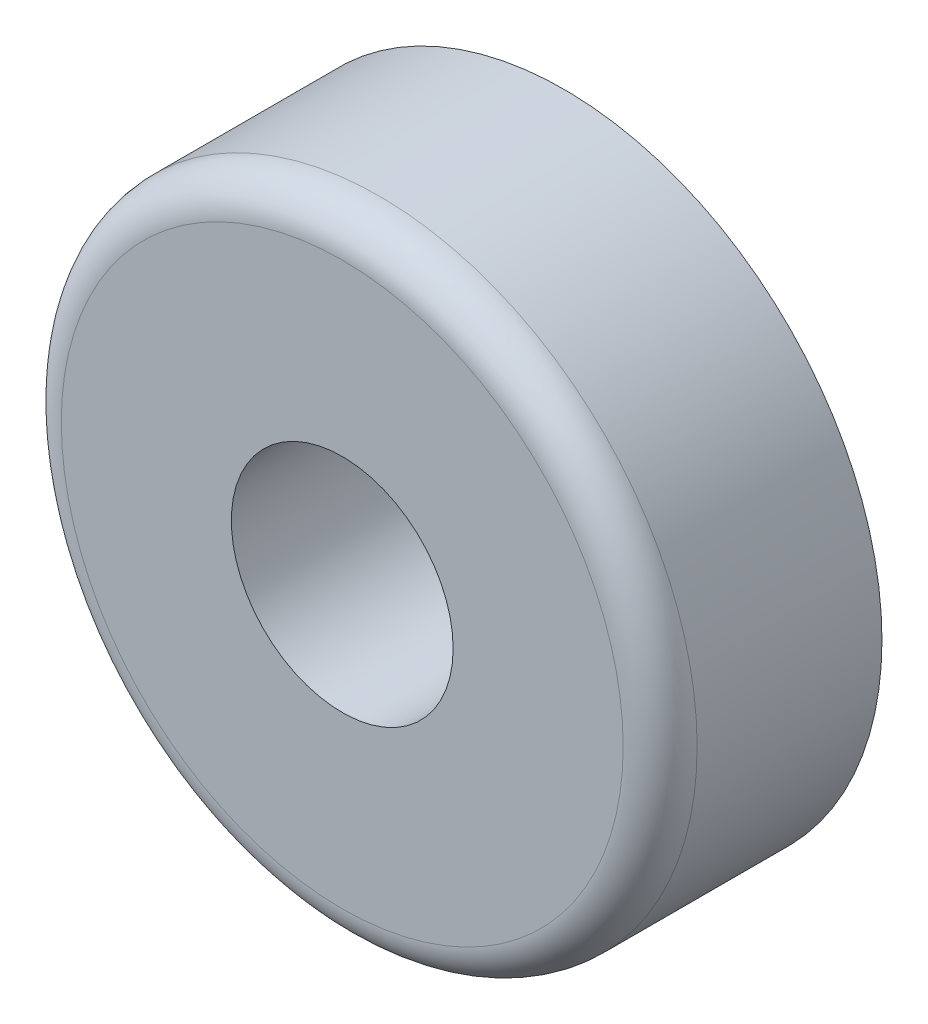
ISO-10303-21;
HEADER;
FILE_DESCRIPTION(('STEP AP214'),'2;1');
FILE_NAME('part.step','',(''),(''),'','','');
FILE_SCHEMA(('AUTOMOTIVE_DESIGN { 1 0 10303 214 1 1 1 1 }'));
ENDSEC;
DATA;
#1=APPLICATION_CONTEXT('core data for automotive mechanical design processes');
#2=APPLICATION_PROTOCOL_DEFINITION('international standard','automotive_design',2000,#1);
#3=PRODUCT_CONTEXT('',#1,'mechanical');
#4=PRODUCT('Part','Part','',(#3));
#5=PRODUCT_RELATED_PRODUCT_CATEGORY('part','',(#4));
#6=PRODUCT_DEFINITION_FORMATION('','',#4);
#7=PRODUCT_DEFINITION_CONTEXT('part definition',#1,'design');
#8=PRODUCT_DEFINITION('design','',#6,#7);
#9=PRODUCT_DEFINITION_SHAPE('','',#8);
#10=(LENGTH_UNIT() NAMED_UNIT(*) SI_UNIT(.MILLI.,.METRE.));
#11=(NAMED_UNIT(*) PLANE_ANGLE_UNIT() SI_UNIT($,.RADIAN.));
#12=(NAMED_UNIT(*) SI_UNIT($,.STERADIAN.) SOLID_ANGLE_UNIT());
#13=UNCERTAINTY_MEASURE_WITH_UNIT(LENGTH_MEASURE(1.E-05),#10,'distance_accuracy_value','');
#14=(GEOMETRIC_REPRESENTATION_CONTEXT(3) GLOBAL_UNCERTAINTY_ASSIGNED_CONTEXT((#13)) GLOBAL_UNIT_ASSIGNED_CONTEXT((#10,
#11,#12)) REPRESENTATION_CONTEXT('',''));
#15=CARTESIAN_POINT('',(0.,0.,0.));
#16=DIRECTION('',(0.,0.,1.));
#17=DIRECTION('',(1.,0.,0.));
#18=AXIS2_PLACEMENT_3D('',#15,#16,#17);
#19=CARTESIAN_POINT('',(0.,0.,3.));
#20=DIRECTION('',(0.,0.,1.));
#21=DIRECTION('',(1.,0.,0.));
#22=AXIS2_PLACEMENT_3D('',#19,#20,#21);
#23=PLANE('',#22);
#24=CARTESIAN_POINT('',(0.,0.,3.));
#25=DIRECTION('',(0.,0.,1.));
#26=DIRECTION('',(1.,0.,0.));
#27=AXIS2_PLACEMENT_3D('',#24,#25,#26);
#28=CIRCLE('',#27,3.8);
#29=CARTESIAN_POINT('',(3.8,0.,3.));
#30=VERTEX_POINT('',#29);
#31=EDGE_CURVE('E49',#30,#30,#28,.T.);
#32=ORIENTED_EDGE('',*,*,#31,.T.);
#33=EDGE_LOOP('',(#32));
#34=FACE_BOUND('',#33,.T.);
#35=CARTESIAN_POINT('',(0.,0.,3.));
#36=DIRECTION('',(0.,0.,1.));
#37=DIRECTION('',(1.,0.,0.));
#38=AXIS2_PLACEMENT_3D('',#35,#36,#37);
#39=CIRCLE('',#38,1.5);
#40=CARTESIAN_POINT('',(1.5,0.,3.));
#41=VERTEX_POINT('',#40);
#42=EDGE_CURVE('E59',#41,#41,#39,.T.);
#43=ORIENTED_EDGE('',*,*,#42,.F.);
#44=EDGE_LOOP('',(#43));
#45=FACE_BOUND('',#44,.T.);
#46=ADVANCED_FACE('F41',(#34,#45),#23,.T.);
#47=CARTESIAN_POINT('',(0.,0.,0.));
#48=DIRECTION('',(0.,0.,1.));
#49=DIRECTION('',(1.,0.,0.));
#50=AXIS2_PLACEMENT_3D('',#47,#48,#49);
#51=PLANE('',#50);
#52=CARTESIAN_POINT('',(0.,0.,0.));
#53=DIRECTION('',(0.,0.,1.));
#54=DIRECTION('',(1.,0.,0.));
#55=AXIS2_PLACEMENT_3D('',#52,#53,#54);
#56=CIRCLE('',#55,4.3);
#57=CARTESIAN_POINT('',(4.3,0.,0.));
#58=VERTEX_POINT('',#57);
#59=EDGE_CURVE('E54',#58,#58,#56,.T.);
#60=ORIENTED_EDGE('',*,*,#59,.F.);
#61=EDGE_LOOP('',(#60));
#62=FACE_BOUND('',#61,.T.);
#63=CARTESIAN_POINT('',(0.,0.,0.));
#64=DIRECTION('',(0.,0.,1.));
#65=DIRECTION('',(1.,0.,0.));
#66=AXIS2_PLACEMENT_3D('',#63,#64,#65);
#67=CIRCLE('',#66,1.5);
#68=CARTESIAN_POINT('',(1.5,0.,0.));
#69=VERTEX_POINT('',#68);
#70=EDGE_CURVE('E62',#69,#69,#67,.T.);
#71=ORIENTED_EDGE('',*,*,#70,.T.);
#72=EDGE_LOOP('',(#71));
#73=FACE_BOUND('',#72,.T.);
#74=ADVANCED_FACE('F74',(#62,#73),#51,.F.);
#75=CARTESIAN_POINT('',(0.,0.,3.));
#76=DIRECTION('',(0.,0.,-1.));
#77=DIRECTION('',(-1.,0.,0.));
#78=AXIS2_PLACEMENT_3D('',#75,#76,#77);
#79=CYLINDRICAL_SURFACE('',#78,4.3);
#80=CARTESIAN_POINT('',(0.,0.,2.5));
#81=DIRECTION('',(0.,0.,1.));
#82=DIRECTION('',(1.,0.,0.));
#83=AXIS2_PLACEMENT_3D('',#80,#81,#82);
#84=CIRCLE('',#83,4.3);
#85=CARTESIAN_POINT('',(4.3,0.,2.5));
#86=VERTEX_POINT('',#85);
#87=EDGE_CURVE('E10',#86,#86,#84,.F.);
#88=ORIENTED_EDGE('',*,*,#87,.T.);
#89=EDGE_LOOP('',(#88));
#90=FACE_BOUND('',#89,.T.);
#91=ORIENTED_EDGE('',*,*,#59,.T.);
#92=EDGE_LOOP('',(#91));
#93=FACE_BOUND('',#92,.T.);
#94=ADVANCED_FACE('F79',(#90,#93),#79,.T.);
#95=CARTESIAN_POINT('',(0.,0.,3.));
#96=DIRECTION('',(0.,0.,-1.));
#97=DIRECTION('',(-1.,0.,0.));
#98=AXIS2_PLACEMENT_3D('',#95,#96,#97);
#99=CYLINDRICAL_SURFACE('',#98,1.5);
#100=ORIENTED_EDGE('',*,*,#42,.T.);
#101=EDGE_LOOP('',(#100));
#102=FACE_BOUND('',#101,.T.);
#103=ORIENTED_EDGE('',*,*,#70,.F.);
#104=EDGE_LOOP('',(#103));
#105=FACE_BOUND('',#104,.T.);
#106=ADVANCED_FACE('F70',(#102,#105),#99,.F.);
#107=CARTESIAN_POINT('',(0.,0.,2.5));
#108=DIRECTION('',(0.,0.,1.));
#109=DIRECTION('',(1.,0.,0.));
#110=AXIS2_PLACEMENT_3D('',#107,#108,#109);
#111=TOROIDAL_SURFACE('',#110,3.8,0.5);
#112=ORIENTED_EDGE('',*,*,#87,.F.);
#113=EDGE_LOOP('',(#112));
#114=FACE_BOUND('',#113,.T.);
#115=ORIENTED_EDGE('',*,*,#31,.F.);
#116=EDGE_LOOP('',(#115));
#117=FACE_BOUND('',#116,.T.);
#118=ADVANCED_FACE('F43',(#114,#117),#111,.T.);
#119=CLOSED_SHELL('',(#46,#74,#94,#106,#118));
#120=MANIFOLD_SOLID_BREP('B2',#119);
#121=ADVANCED_BREP_SHAPE_REPRESENTATION('',(#18,#120),#14);
#122=SHAPE_DEFINITION_REPRESENTATION(#9,#121);
ENDSEC;
END-ISO-10303-21;
